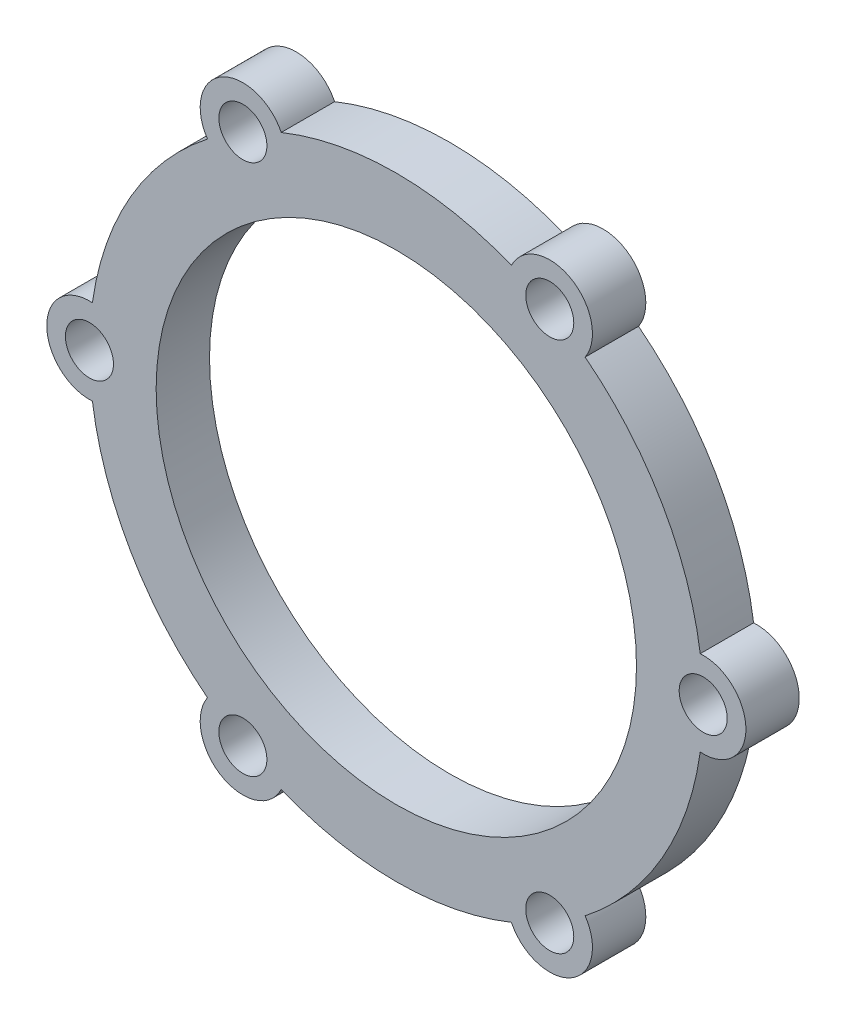
ISO-10303-21;
HEADER;
FILE_DESCRIPTION(('STEP AP214'),'2;1');
FILE_NAME('part.step','',(''),(''),'','','');
FILE_SCHEMA(('AUTOMOTIVE_DESIGN { 1 0 10303 214 1 1 1 1 }'));
ENDSEC;
DATA;
#1=APPLICATION_CONTEXT('core data for automotive mechanical design processes');
#2=APPLICATION_PROTOCOL_DEFINITION('international standard','automotive_design',2000,#1);
#3=PRODUCT_CONTEXT('',#1,'mechanical');
#4=PRODUCT('Part','Part','',(#3));
#5=PRODUCT_RELATED_PRODUCT_CATEGORY('part','',(#4));
#6=PRODUCT_DEFINITION_FORMATION('','',#4);
#7=PRODUCT_DEFINITION_CONTEXT('part definition',#1,'design');
#8=PRODUCT_DEFINITION('design','',#6,#7);
#9=PRODUCT_DEFINITION_SHAPE('','',#8);
#10=(LENGTH_UNIT() NAMED_UNIT(*) SI_UNIT(.MILLI.,.METRE.));
#11=(NAMED_UNIT(*) PLANE_ANGLE_UNIT() SI_UNIT($,.RADIAN.));
#12=(NAMED_UNIT(*) SI_UNIT($,.STERADIAN.) SOLID_ANGLE_UNIT());
#13=UNCERTAINTY_MEASURE_WITH_UNIT(LENGTH_MEASURE(1.E-05),#10,'distance_accuracy_value','');
#14=(GEOMETRIC_REPRESENTATION_CONTEXT(3) GLOBAL_UNCERTAINTY_ASSIGNED_CONTEXT((#13)) GLOBAL_UNIT_ASSIGNED_CONTEXT((#10,
#11,#12)) REPRESENTATION_CONTEXT('',''));
#15=CARTESIAN_POINT('',(0.,0.,0.));
#16=DIRECTION('',(0.,0.,1.));
#17=DIRECTION('',(1.,0.,0.));
#18=AXIS2_PLACEMENT_3D('',#15,#16,#17);
#19=CARTESIAN_POINT('',(0.,0.,5.));
#20=DIRECTION('',(0.,0.,-1.));
#21=DIRECTION('',(-1.,0.,0.));
#22=AXIS2_PLACEMENT_3D('',#19,#20,#21);
#23=CYLINDRICAL_SURFACE('',#22,57.5);
#24=CARTESIAN_POINT('',(0.,0.,-5.));
#25=DIRECTION('',(0.,0.,1.));
#26=DIRECTION('',(1.,0.,0.));
#27=AXIS2_PLACEMENT_3D('',#24,#25,#26);
#28=CIRCLE('',#27,57.5);
#29=CARTESIAN_POINT('',(-21.5603201252367,-53.3048083768933,-5.));
#30=VERTEX_POINT('',#29);
#31=CARTESIAN_POINT('',(21.5603201252378,-53.3048083768929,-5.));
#32=VERTEX_POINT('',#31);
#33=EDGE_CURVE('E181',#30,#32,#28,.T.);
#34=ORIENTED_EDGE('',*,*,#33,.T.);
#35=DIRECTION('',(0.,0.,1.));
#36=VECTOR('',#35,1.);
#37=CARTESIAN_POINT('',(21.5603201252378,-53.3048083768928,0.));
#38=LINE('',#37,#36);
#39=CARTESIAN_POINT('',(21.5603201252378,-53.3048083768929,5.));
#40=VERTEX_POINT('',#39);
#41=EDGE_CURVE('E12',#32,#40,#38,.T.);
#42=ORIENTED_EDGE('',*,*,#41,.T.);
#43=CARTESIAN_POINT('',(0.,0.,5.));
#44=DIRECTION('',(0.,0.,1.));
#45=DIRECTION('',(1.,0.,0.));
#46=AXIS2_PLACEMENT_3D('',#43,#44,#45);
#47=CIRCLE('',#46,57.5);
#48=CARTESIAN_POINT('',(-21.5603201252367,-53.3048083768933,5.));
#49=VERTEX_POINT('',#48);
#50=EDGE_CURVE('E180',#49,#40,#47,.T.);
#51=ORIENTED_EDGE('',*,*,#50,.F.);
#52=DIRECTION('',(0.,0.,1.));
#53=VECTOR('',#52,1.);
#54=CARTESIAN_POINT('',(-21.5603201252367,-53.3048083768933,0.));
#55=LINE('',#54,#53);
#56=EDGE_CURVE('E234',#49,#30,#55,.F.);
#57=ORIENTED_EDGE('',*,*,#56,.T.);
#58=EDGE_LOOP('',(#34,#42,#51,#57));
#59=FACE_BOUND('',#58,.T.);
#60=ADVANCED_FACE('F51',(#59),#23,.T.);
#61=CARTESIAN_POINT('',(-56.9434782608696,-7.98061924626624,-5.));
#62=VERTEX_POINT('',#61);
#63=CARTESIAN_POINT('',(-35.383158135632,-45.3241891306272,-5.));
#64=VERTEX_POINT('',#63);
#65=EDGE_CURVE('E195',#62,#64,#28,.T.);
#66=ORIENTED_EDGE('',*,*,#65,.T.);
#67=DIRECTION('',(0.,0.,1.));
#68=VECTOR('',#67,1.);
#69=CARTESIAN_POINT('',(-35.383158135632,-45.3241891306272,0.));
#70=LINE('',#69,#68);
#71=CARTESIAN_POINT('',(-35.383158135632,-45.3241891306272,5.));
#72=VERTEX_POINT('',#71);
#73=EDGE_CURVE('E311',#64,#72,#70,.T.);
#74=ORIENTED_EDGE('',*,*,#73,.T.);
#75=CARTESIAN_POINT('',(-56.9434782608696,-7.98061924626624,5.));
#76=VERTEX_POINT('',#75);
#77=EDGE_CURVE('E220',#76,#72,#47,.T.);
#78=ORIENTED_EDGE('',*,*,#77,.F.);
#79=DIRECTION('',(0.,0.,1.));
#80=VECTOR('',#79,1.);
#81=CARTESIAN_POINT('',(-56.9434782608696,-7.98061924626624,0.));
#82=LINE('',#81,#80);
#83=EDGE_CURVE('E303',#76,#62,#82,.F.);
#84=ORIENTED_EDGE('',*,*,#83,.T.);
#85=EDGE_LOOP('',(#66,#74,#78,#84));
#86=FACE_BOUND('',#85,.T.);
#87=ADVANCED_FACE('F393',(#86),#23,.T.);
#88=CARTESIAN_POINT('',(-35.3831581356326,45.3241891306267,-5.));
#89=VERTEX_POINT('',#88);
#90=CARTESIAN_POINT('',(-56.9434782608696,7.98061924626624,-5.));
#91=VERTEX_POINT('',#90);
#92=EDGE_CURVE('E176',#89,#91,#28,.T.);
#93=ORIENTED_EDGE('',*,*,#92,.T.);
#94=DIRECTION('',(0.,0.,1.));
#95=VECTOR('',#94,1.);
#96=CARTESIAN_POINT('',(-56.9434782608696,7.98061924626624,0.));
#97=LINE('',#96,#95);
#98=CARTESIAN_POINT('',(-56.9434782608696,7.98061924626624,5.));
#99=VERTEX_POINT('',#98);
#100=EDGE_CURVE('E307',#91,#99,#97,.T.);
#101=ORIENTED_EDGE('',*,*,#100,.T.);
#102=CARTESIAN_POINT('',(-35.3831581356326,45.3241891306267,5.));
#103=VERTEX_POINT('',#102);
#104=EDGE_CURVE('E215',#103,#99,#47,.T.);
#105=ORIENTED_EDGE('',*,*,#104,.F.);
#106=DIRECTION('',(0.,0.,1.));
#107=VECTOR('',#106,1.);
#108=CARTESIAN_POINT('',(-35.3831581356326,45.3241891306267,0.));
#109=LINE('',#108,#107);
#110=EDGE_CURVE('E155',#103,#89,#109,.F.);
#111=ORIENTED_EDGE('',*,*,#110,.T.);
#112=EDGE_LOOP('',(#93,#101,#105,#111));
#113=FACE_BOUND('',#112,.T.);
#114=ADVANCED_FACE('F399',(#113),#23,.T.);
#115=CARTESIAN_POINT('',(21.5603201252371,53.3048083768931,-5.));
#116=VERTEX_POINT('',#115);
#117=CARTESIAN_POINT('',(-21.5603201252374,53.304808376893,-5.));
#118=VERTEX_POINT('',#117);
#119=EDGE_CURVE('E163',#116,#118,#28,.T.);
#120=ORIENTED_EDGE('',*,*,#119,.T.);
#121=DIRECTION('',(0.,0.,1.));
#122=VECTOR('',#121,1.);
#123=CARTESIAN_POINT('',(-21.5603201252374,53.304808376893,0.));
#124=LINE('',#123,#122);
#125=CARTESIAN_POINT('',(-21.5603201252374,53.304808376893,5.));
#126=VERTEX_POINT('',#125);
#127=EDGE_CURVE('E296',#118,#126,#124,.T.);
#128=ORIENTED_EDGE('',*,*,#127,.T.);
#129=CARTESIAN_POINT('',(21.5603201252371,53.3048083768931,5.));
#130=VERTEX_POINT('',#129);
#131=EDGE_CURVE('E202',#130,#126,#47,.T.);
#132=ORIENTED_EDGE('',*,*,#131,.F.);
#133=DIRECTION('',(0.,0.,1.));
#134=VECTOR('',#133,1.);
#135=CARTESIAN_POINT('',(21.5603201252371,53.3048083768931,0.));
#136=LINE('',#135,#134);
#137=EDGE_CURVE('E153',#130,#116,#136,.F.);
#138=ORIENTED_EDGE('',*,*,#137,.T.);
#139=EDGE_LOOP('',(#120,#128,#132,#138));
#140=FACE_BOUND('',#139,.T.);
#141=ADVANCED_FACE('F409',(#140),#23,.T.);
#142=CARTESIAN_POINT('',(56.9434782608696,7.98061924626624,-5.));
#143=VERTEX_POINT('',#142);
#144=CARTESIAN_POINT('',(35.3831581356323,45.3241891306269,-5.));
#145=VERTEX_POINT('',#144);
#146=EDGE_CURVE('E161',#143,#145,#28,.T.);
#147=ORIENTED_EDGE('',*,*,#146,.T.);
#148=DIRECTION('',(0.,0.,1.));
#149=VECTOR('',#148,1.);
#150=CARTESIAN_POINT('',(35.3831581356323,45.3241891306269,0.));
#151=LINE('',#150,#149);
#152=CARTESIAN_POINT('',(35.3831581356323,45.3241891306269,5.));
#153=VERTEX_POINT('',#152);
#154=EDGE_CURVE('E136',#145,#153,#151,.T.);
#155=ORIENTED_EDGE('',*,*,#154,.T.);
#156=CARTESIAN_POINT('',(56.9434782608696,7.98061924626624,5.));
#157=VERTEX_POINT('',#156);
#158=EDGE_CURVE('E179',#157,#153,#47,.T.);
#159=ORIENTED_EDGE('',*,*,#158,.F.);
#160=DIRECTION('',(0.,0.,1.));
#161=VECTOR('',#160,1.);
#162=CARTESIAN_POINT('',(56.9434782608696,7.98061924626624,0.));
#163=LINE('',#162,#161);
#164=EDGE_CURVE('E168',#157,#143,#163,.F.);
#165=ORIENTED_EDGE('',*,*,#164,.T.);
#166=EDGE_LOOP('',(#147,#155,#159,#165));
#167=FACE_BOUND('',#166,.T.);
#168=ADVANCED_FACE('F166',(#167),#23,.T.);
#169=CARTESIAN_POINT('',(0.,0.,5.));
#170=DIRECTION('',(0.,0.,1.));
#171=DIRECTION('',(1.,0.,0.));
#172=AXIS2_PLACEMENT_3D('',#169,#170,#171);
#173=PLANE('',#172);
#174=CARTESIAN_POINT('',(28.7500000000006,-49.7964607176049,5.));
#175=DIRECTION('',(0.,0.,1.));
#176=DIRECTION('',(1.,0.,0.));
#177=AXIS2_PLACEMENT_3D('',#174,#175,#176);
#178=CIRCLE('',#177,4.5);
#179=CARTESIAN_POINT('',(33.2500000000006,-49.7964607176049,5.));
#180=VERTEX_POINT('',#179);
#181=EDGE_CURVE('E245',#180,#180,#178,.T.);
#182=ORIENTED_EDGE('',*,*,#181,.F.);
#183=EDGE_LOOP('',(#182));
#184=FACE_BOUND('',#183,.T.);
#185=CARTESIAN_POINT('',(-28.7499999999995,-49.7964607176055,5.));
#186=DIRECTION('',(0.,0.,1.));
#187=DIRECTION('',(1.,0.,0.));
#188=AXIS2_PLACEMENT_3D('',#185,#186,#187);
#189=CIRCLE('',#188,4.5);
#190=CARTESIAN_POINT('',(-24.2499999999995,-49.7964607176055,5.));
#191=VERTEX_POINT('',#190);
#192=EDGE_CURVE('E338',#191,#191,#189,.T.);
#193=ORIENTED_EDGE('',*,*,#192,.F.);
#194=EDGE_LOOP('',(#193));
#195=FACE_BOUND('',#194,.T.);
#196=CARTESIAN_POINT('',(-57.5,0.,5.));
#197=DIRECTION('',(0.,0.,1.));
#198=DIRECTION('',(1.,0.,0.));
#199=AXIS2_PLACEMENT_3D('',#196,#197,#198);
#200=CIRCLE('',#199,4.5);
#201=CARTESIAN_POINT('',(-53.,0.,5.));
#202=VERTEX_POINT('',#201);
#203=EDGE_CURVE('E344',#202,#202,#200,.T.);
#204=ORIENTED_EDGE('',*,*,#203,.F.);
#205=EDGE_LOOP('',(#204));
#206=FACE_BOUND('',#205,.T.);
#207=CARTESIAN_POINT('',(-28.7500000000002,49.7964607176051,5.));
#208=DIRECTION('',(0.,0.,1.));
#209=DIRECTION('',(1.,0.,0.));
#210=AXIS2_PLACEMENT_3D('',#207,#208,#209);
#211=CIRCLE('',#210,4.5);
#212=CARTESIAN_POINT('',(-24.2500000000002,49.7964607176051,5.));
#213=VERTEX_POINT('',#212);
#214=EDGE_CURVE('E346',#213,#213,#211,.T.);
#215=ORIENTED_EDGE('',*,*,#214,.F.);
#216=EDGE_LOOP('',(#215));
#217=FACE_BOUND('',#216,.T.);
#218=CARTESIAN_POINT('',(28.7499999999999,49.7964607176053,5.));
#219=DIRECTION('',(0.,0.,1.));
#220=DIRECTION('',(1.,0.,0.));
#221=AXIS2_PLACEMENT_3D('',#218,#219,#220);
#222=CIRCLE('',#221,4.5);
#223=CARTESIAN_POINT('',(33.2499999999999,49.7964607176053,5.));
#224=VERTEX_POINT('',#223);
#225=EDGE_CURVE('E355',#224,#224,#222,.T.);
#226=ORIENTED_EDGE('',*,*,#225,.F.);
#227=EDGE_LOOP('',(#226));
#228=FACE_BOUND('',#227,.T.);
#229=ORIENTED_EDGE('',*,*,#50,.T.);
#230=CARTESIAN_POINT('',(28.7500000000006,-49.7964607176049,5.));
#231=DIRECTION('',(0.,0.,1.));
#232=DIRECTION('',(0.50000000000001,-0.866025403784433,0.));
#233=AXIS2_PLACEMENT_3D('',#230,#231,#232);
#234=CIRCLE('',#233,8.);
#235=CARTESIAN_POINT('',(35.3831581356329,-45.3241891306265,5.));
#236=VERTEX_POINT('',#235);
#237=EDGE_CURVE('E228',#40,#236,#234,.T.);
#238=ORIENTED_EDGE('',*,*,#237,.T.);
#239=CARTESIAN_POINT('',(56.9434782608696,-7.98061924626624,5.));
#240=VERTEX_POINT('',#239);
#241=EDGE_CURVE('E175',#236,#240,#47,.T.);
#242=ORIENTED_EDGE('',*,*,#241,.T.);
#243=CARTESIAN_POINT('',(57.5,0.,5.));
#244=DIRECTION('',(0.,0.,1.));
#245=DIRECTION('',(1.,0.,0.));
#246=AXIS2_PLACEMENT_3D('',#243,#244,#245);
#247=CIRCLE('',#246,8.);
#248=EDGE_CURVE('E251',#240,#157,#247,.T.);
#249=ORIENTED_EDGE('',*,*,#248,.T.);
#250=ORIENTED_EDGE('',*,*,#158,.T.);
#251=CARTESIAN_POINT('',(28.7499999999999,49.7964607176053,5.));
#252=DIRECTION('',(0.,0.,1.));
#253=DIRECTION('',(0.499999999999998,0.86602540378444,0.));
#254=AXIS2_PLACEMENT_3D('',#251,#252,#253);
#255=CIRCLE('',#254,8.);
#256=EDGE_CURVE('E148',#153,#130,#255,.T.);
#257=ORIENTED_EDGE('',*,*,#256,.T.);
#258=ORIENTED_EDGE('',*,*,#131,.T.);
#259=CARTESIAN_POINT('',(-28.7500000000002,49.7964607176051,5.));
#260=DIRECTION('',(0.,0.,1.));
#261=DIRECTION('',(-0.500000000000004,0.866025403784436,0.));
#262=AXIS2_PLACEMENT_3D('',#259,#260,#261);
#263=CIRCLE('',#262,8.);
#264=EDGE_CURVE('E323',#126,#103,#263,.T.);
#265=ORIENTED_EDGE('',*,*,#264,.T.);
#266=ORIENTED_EDGE('',*,*,#104,.T.);
#267=CARTESIAN_POINT('',(-57.5,0.,5.));
#268=DIRECTION('',(0.,0.,1.));
#269=DIRECTION('',(-1.,0.,0.));
#270=AXIS2_PLACEMENT_3D('',#267,#268,#269);
#271=CIRCLE('',#270,8.);
#272=EDGE_CURVE('E329',#99,#76,#271,.T.);
#273=ORIENTED_EDGE('',*,*,#272,.T.);
#274=ORIENTED_EDGE('',*,*,#77,.T.);
#275=CARTESIAN_POINT('',(-28.7499999999995,-49.7964607176055,5.));
#276=DIRECTION('',(0.,0.,1.));
#277=DIRECTION('',(-0.499999999999992,-0.866025403784443,0.));
#278=AXIS2_PLACEMENT_3D('',#275,#276,#277);
#279=CIRCLE('',#278,8.);
#280=EDGE_CURVE('E235',#72,#49,#279,.T.);
#281=ORIENTED_EDGE('',*,*,#280,.T.);
#282=EDGE_LOOP('',(#229,#238,#242,#249,#250,#257,#258,#265,#266,#273,#274,#281));
#283=FACE_BOUND('',#282,.T.);
#284=CARTESIAN_POINT('',(57.5,0.,5.000012));
#285=DIRECTION('',(0.,0.,1.));
#286=DIRECTION('',(1.,0.,0.));
#287=AXIS2_PLACEMENT_3D('',#284,#285,#286);
#288=CIRCLE('',#287,4.5);
#289=CARTESIAN_POINT('',(62.,0.,5.000012));
#290=VERTEX_POINT('',#289);
#291=EDGE_CURVE('E167',#290,#290,#288,.T.);
#292=ORIENTED_EDGE('',*,*,#291,.F.);
#293=EDGE_LOOP('',(#292));
#294=FACE_BOUND('',#293,.T.);
#295=CARTESIAN_POINT('',(0.,0.,5.));
#296=DIRECTION('',(0.,0.,1.));
#297=DIRECTION('',(0.,1.,0.));
#298=AXIS2_PLACEMENT_3D('',#295,#296,#297);
#299=CIRCLE('',#298,45.);
#300=CARTESIAN_POINT('',(0.,45.,5.));
#301=VERTEX_POINT('',#300);
#302=EDGE_CURVE('E184',#301,#301,#299,.T.);
#303=ORIENTED_EDGE('',*,*,#302,.F.);
#304=EDGE_LOOP('',(#303));
#305=FACE_BOUND('',#304,.T.);
#306=ADVANCED_FACE('F229',(#184,#195,#206,#217,#228,#283,#294,#305),#173,.T.);
#307=CARTESIAN_POINT('',(0.,0.,-5.));
#308=DIRECTION('',(0.,0.,1.));
#309=DIRECTION('',(1.,0.,0.));
#310=AXIS2_PLACEMENT_3D('',#307,#308,#309);
#311=PLANE('',#310);
#312=CARTESIAN_POINT('',(28.7500000000006,-49.7964607176049,-5.));
#313=DIRECTION('',(0.,0.,1.));
#314=DIRECTION('',(0.50000000000001,-0.866025403784433,0.));
#315=AXIS2_PLACEMENT_3D('',#312,#313,#314);
#316=CIRCLE('',#315,4.5);
#317=CARTESIAN_POINT('',(31.0000000000006,-53.6935750346348,-5.));
#318=VERTEX_POINT('',#317);
#319=EDGE_CURVE('E363',#318,#318,#316,.T.);
#320=ORIENTED_EDGE('',*,*,#319,.T.);
#321=EDGE_LOOP('',(#320));
#322=FACE_BOUND('',#321,.T.);
#323=CARTESIAN_POINT('',(-28.7499999999995,-49.7964607176055,-5.));
#324=DIRECTION('',(0.,0.,1.));
#325=DIRECTION('',(-0.499999999999992,-0.866025403784443,0.));
#326=AXIS2_PLACEMENT_3D('',#323,#324,#325);
#327=CIRCLE('',#326,4.5);
#328=CARTESIAN_POINT('',(-30.9999999999995,-53.6935750346355,-5.));
#329=VERTEX_POINT('',#328);
#330=EDGE_CURVE('E364',#329,#329,#327,.T.);
#331=ORIENTED_EDGE('',*,*,#330,.T.);
#332=EDGE_LOOP('',(#331));
#333=FACE_BOUND('',#332,.T.);
#334=CARTESIAN_POINT('',(-57.5,0.,-5.));
#335=DIRECTION('',(0.,0.,1.));
#336=DIRECTION('',(-1.,0.,0.));
#337=AXIS2_PLACEMENT_3D('',#334,#335,#336);
#338=CIRCLE('',#337,4.5);
#339=CARTESIAN_POINT('',(-62.,0.,-5.));
#340=VERTEX_POINT('',#339);
#341=EDGE_CURVE('E369',#340,#340,#338,.T.);
#342=ORIENTED_EDGE('',*,*,#341,.T.);
#343=EDGE_LOOP('',(#342));
#344=FACE_BOUND('',#343,.T.);
#345=CARTESIAN_POINT('',(-28.7500000000002,49.7964607176051,-5.));
#346=DIRECTION('',(0.,0.,1.));
#347=DIRECTION('',(-0.500000000000004,0.866025403784436,0.));
#348=AXIS2_PLACEMENT_3D('',#345,#346,#347);
#349=CIRCLE('',#348,4.5);
#350=CARTESIAN_POINT('',(-31.0000000000003,53.6935750346351,-5.));
#351=VERTEX_POINT('',#350);
#352=EDGE_CURVE('E356',#351,#351,#349,.T.);
#353=ORIENTED_EDGE('',*,*,#352,.T.);
#354=EDGE_LOOP('',(#353));
#355=FACE_BOUND('',#354,.T.);
#356=CARTESIAN_POINT('',(28.7499999999999,49.7964607176053,-5.));
#357=DIRECTION('',(0.,0.,1.));
#358=DIRECTION('',(0.499999999999998,0.86602540378444,0.));
#359=AXIS2_PLACEMENT_3D('',#356,#357,#358);
#360=CIRCLE('',#359,4.5);
#361=CARTESIAN_POINT('',(30.9999999999999,53.6935750346353,-5.));
#362=VERTEX_POINT('',#361);
#363=EDGE_CURVE('E357',#362,#362,#360,.T.);
#364=ORIENTED_EDGE('',*,*,#363,.T.);
#365=EDGE_LOOP('',(#364));
#366=FACE_BOUND('',#365,.T.);
#367=ORIENTED_EDGE('',*,*,#119,.F.);
#368=CARTESIAN_POINT('',(28.7499999999999,49.7964607176053,-5.));
#369=DIRECTION('',(0.,0.,1.));
#370=DIRECTION('',(1.,0.,0.));
#371=AXIS2_PLACEMENT_3D('',#368,#369,#370);
#372=CIRCLE('',#371,8.);
#373=EDGE_CURVE('E141',#116,#145,#372,.F.);
#374=ORIENTED_EDGE('',*,*,#373,.T.);
#375=ORIENTED_EDGE('',*,*,#146,.F.);
#376=CARTESIAN_POINT('',(57.5,0.,-5.));
#377=DIRECTION('',(0.,0.,1.));
#378=DIRECTION('',(1.,0.,0.));
#379=AXIS2_PLACEMENT_3D('',#376,#377,#378);
#380=CIRCLE('',#379,8.);
#381=CARTESIAN_POINT('',(56.9434782608696,-7.98061924626624,-5.));
#382=VERTEX_POINT('',#381);
#383=EDGE_CURVE('E199',#143,#382,#380,.F.);
#384=ORIENTED_EDGE('',*,*,#383,.T.);
#385=CARTESIAN_POINT('',(35.3831581356329,-45.3241891306264,-5.));
#386=VERTEX_POINT('',#385);
#387=EDGE_CURVE('E171',#386,#382,#28,.T.);
#388=ORIENTED_EDGE('',*,*,#387,.F.);
#389=CARTESIAN_POINT('',(28.7500000000006,-49.7964607176049,-5.));
#390=DIRECTION('',(0.,0.,1.));
#391=DIRECTION('',(1.,0.,0.));
#392=AXIS2_PLACEMENT_3D('',#389,#390,#391);
#393=CIRCLE('',#392,8.);
#394=EDGE_CURVE('E70',#386,#32,#393,.F.);
#395=ORIENTED_EDGE('',*,*,#394,.T.);
#396=ORIENTED_EDGE('',*,*,#33,.F.);
#397=CARTESIAN_POINT('',(-28.7499999999995,-49.7964607176055,-5.));
#398=DIRECTION('',(0.,0.,1.));
#399=DIRECTION('',(1.,0.,0.));
#400=AXIS2_PLACEMENT_3D('',#397,#398,#399);
#401=CIRCLE('',#400,8.);
#402=EDGE_CURVE('E73',#30,#64,#401,.F.);
#403=ORIENTED_EDGE('',*,*,#402,.T.);
#404=ORIENTED_EDGE('',*,*,#65,.F.);
#405=CARTESIAN_POINT('',(-57.5,0.,-5.));
#406=DIRECTION('',(0.,0.,1.));
#407=DIRECTION('',(1.,0.,0.));
#408=AXIS2_PLACEMENT_3D('',#405,#406,#407);
#409=CIRCLE('',#408,8.);
#410=EDGE_CURVE('E326',#62,#91,#409,.F.);
#411=ORIENTED_EDGE('',*,*,#410,.T.);
#412=ORIENTED_EDGE('',*,*,#92,.F.);
#413=CARTESIAN_POINT('',(-28.7500000000002,49.7964607176051,-5.));
#414=DIRECTION('',(0.,0.,1.));
#415=DIRECTION('',(1.,0.,0.));
#416=AXIS2_PLACEMENT_3D('',#413,#414,#415);
#417=CIRCLE('',#416,8.);
#418=EDGE_CURVE('E250',#89,#118,#417,.F.);
#419=ORIENTED_EDGE('',*,*,#418,.T.);
#420=EDGE_LOOP('',(#367,#374,#375,#384,#388,#395,#396,#403,#404,#411,#412,#419));
#421=FACE_BOUND('',#420,.T.);
#422=CARTESIAN_POINT('',(0.,0.,-5.));
#423=DIRECTION('',(0.,0.,1.));
#424=DIRECTION('',(0.,1.,0.));
#425=AXIS2_PLACEMENT_3D('',#422,#423,#424);
#426=CIRCLE('',#425,45.);
#427=CARTESIAN_POINT('',(0.,45.,-5.));
#428=VERTEX_POINT('',#427);
#429=EDGE_CURVE('E194',#428,#428,#426,.T.);
#430=ORIENTED_EDGE('',*,*,#429,.T.);
#431=EDGE_LOOP('',(#430));
#432=FACE_BOUND('',#431,.T.);
#433=CARTESIAN_POINT('',(57.5,0.,-5.));
#434=DIRECTION('',(0.,0.,1.));
#435=DIRECTION('',(1.,0.,0.));
#436=AXIS2_PLACEMENT_3D('',#433,#434,#435);
#437=CIRCLE('',#436,4.5);
#438=CARTESIAN_POINT('',(62.,0.,-5.));
#439=VERTEX_POINT('',#438);
#440=EDGE_CURVE('E249',#439,#439,#437,.T.);
#441=ORIENTED_EDGE('',*,*,#440,.T.);
#442=EDGE_LOOP('',(#441));
#443=FACE_BOUND('',#442,.T.);
#444=ADVANCED_FACE('F158',(#322,#333,#344,#355,#366,#421,#432,#443),#311,.F.);
#445=ORIENTED_EDGE('',*,*,#241,.F.);
#446=DIRECTION('',(0.,0.,1.));
#447=VECTOR('',#446,1.);
#448=CARTESIAN_POINT('',(35.3831581356329,-45.3241891306265,0.));
#449=LINE('',#448,#447);
#450=EDGE_CURVE('E58',#236,#386,#449,.F.);
#451=ORIENTED_EDGE('',*,*,#450,.T.);
#452=ORIENTED_EDGE('',*,*,#387,.T.);
#453=DIRECTION('',(0.,0.,1.));
#454=VECTOR('',#453,1.);
#455=CARTESIAN_POINT('',(56.9434782608696,-7.98061924626624,0.));
#456=LINE('',#455,#454);
#457=EDGE_CURVE('E209',#382,#240,#456,.T.);
#458=ORIENTED_EDGE('',*,*,#457,.T.);
#459=EDGE_LOOP('',(#445,#451,#452,#458));
#460=FACE_BOUND('',#459,.T.);
#461=ADVANCED_FACE('F52',(#460),#23,.T.);
#462=CARTESIAN_POINT('',(0.,0.,5.));
#463=DIRECTION('',(0.,0.,-1.));
#464=DIRECTION('',(-1.,0.,0.));
#465=AXIS2_PLACEMENT_3D('',#462,#463,#464);
#466=CYLINDRICAL_SURFACE('',#465,45.);
#467=ORIENTED_EDGE('',*,*,#302,.T.);
#468=EDGE_LOOP('',(#467));
#469=FACE_BOUND('',#468,.T.);
#470=ORIENTED_EDGE('',*,*,#429,.F.);
#471=EDGE_LOOP('',(#470));
#472=FACE_BOUND('',#471,.T.);
#473=ADVANCED_FACE('F277',(#469,#472),#466,.F.);
#474=CARTESIAN_POINT('',(57.5,0.,-27.6274169979695));
#475=DIRECTION('',(0.,0.,1.));
#476=DIRECTION('',(1.,0.,0.));
#477=AXIS2_PLACEMENT_3D('',#474,#475,#476);
#478=CYLINDRICAL_SURFACE('',#477,8.);
#479=ORIENTED_EDGE('',*,*,#457,.F.);
#480=ORIENTED_EDGE('',*,*,#383,.F.);
#481=ORIENTED_EDGE('',*,*,#164,.F.);
#482=ORIENTED_EDGE('',*,*,#248,.F.);
#483=EDGE_LOOP('',(#479,#480,#481,#482));
#484=FACE_BOUND('',#483,.T.);
#485=ADVANCED_FACE('F271',(#484),#478,.T.);
#486=CARTESIAN_POINT('',(57.5,0.,-5.));
#487=DIRECTION('',(0.,0.,1.));
#488=DIRECTION('',(1.,0.,0.));
#489=AXIS2_PLACEMENT_3D('',#486,#487,#488);
#490=CYLINDRICAL_SURFACE('',#489,4.5);
#491=ORIENTED_EDGE('',*,*,#440,.F.);
#492=EDGE_LOOP('',(#491));
#493=FACE_BOUND('',#492,.T.);
#494=ORIENTED_EDGE('',*,*,#291,.T.);
#495=EDGE_LOOP('',(#494));
#496=FACE_BOUND('',#495,.T.);
#497=ADVANCED_FACE('F261',(#493,#496),#490,.F.);
#498=CARTESIAN_POINT('',(28.7499999999999,49.7964607176053,-27.6274169979695));
#499=DIRECTION('',(0.,0.,1.));
#500=DIRECTION('',(1.,0.,0.));
#501=AXIS2_PLACEMENT_3D('',#498,#499,#500);
#502=CYLINDRICAL_SURFACE('',#501,8.);
#503=ORIENTED_EDGE('',*,*,#154,.F.);
#504=ORIENTED_EDGE('',*,*,#373,.F.);
#505=ORIENTED_EDGE('',*,*,#137,.F.);
#506=ORIENTED_EDGE('',*,*,#256,.F.);
#507=EDGE_LOOP('',(#503,#504,#505,#506));
#508=FACE_BOUND('',#507,.T.);
#509=ADVANCED_FACE('F142',(#508),#502,.T.);
#510=CARTESIAN_POINT('',(-28.7500000000002,49.7964607176051,-27.6274169979695));
#511=DIRECTION('',(0.,0.,1.));
#512=DIRECTION('',(1.,0.,0.));
#513=AXIS2_PLACEMENT_3D('',#510,#511,#512);
#514=CYLINDRICAL_SURFACE('',#513,8.);
#515=ORIENTED_EDGE('',*,*,#127,.F.);
#516=ORIENTED_EDGE('',*,*,#418,.F.);
#517=ORIENTED_EDGE('',*,*,#110,.F.);
#518=ORIENTED_EDGE('',*,*,#264,.F.);
#519=EDGE_LOOP('',(#515,#516,#517,#518));
#520=FACE_BOUND('',#519,.T.);
#521=ADVANCED_FACE('F416',(#520),#514,.T.);
#522=CARTESIAN_POINT('',(-57.5,0.,-27.6274169979695));
#523=DIRECTION('',(0.,0.,1.));
#524=DIRECTION('',(1.,0.,0.));
#525=AXIS2_PLACEMENT_3D('',#522,#523,#524);
#526=CYLINDRICAL_SURFACE('',#525,8.);
#527=ORIENTED_EDGE('',*,*,#100,.F.);
#528=ORIENTED_EDGE('',*,*,#410,.F.);
#529=ORIENTED_EDGE('',*,*,#83,.F.);
#530=ORIENTED_EDGE('',*,*,#272,.F.);
#531=EDGE_LOOP('',(#527,#528,#529,#530));
#532=FACE_BOUND('',#531,.T.);
#533=ADVANCED_FACE('F424',(#532),#526,.T.);
#534=CARTESIAN_POINT('',(-28.7499999999995,-49.7964607176055,-27.6274169979695));
#535=DIRECTION('',(0.,0.,1.));
#536=DIRECTION('',(1.,0.,0.));
#537=AXIS2_PLACEMENT_3D('',#534,#535,#536);
#538=CYLINDRICAL_SURFACE('',#537,8.);
#539=ORIENTED_EDGE('',*,*,#73,.F.);
#540=ORIENTED_EDGE('',*,*,#402,.F.);
#541=ORIENTED_EDGE('',*,*,#56,.F.);
#542=ORIENTED_EDGE('',*,*,#280,.F.);
#543=EDGE_LOOP('',(#539,#540,#541,#542));
#544=FACE_BOUND('',#543,.T.);
#545=ADVANCED_FACE('F426',(#544),#538,.T.);
#546=CARTESIAN_POINT('',(28.7500000000006,-49.7964607176049,-27.6274169979695));
#547=DIRECTION('',(0.,0.,1.));
#548=DIRECTION('',(1.,0.,0.));
#549=AXIS2_PLACEMENT_3D('',#546,#547,#548);
#550=CYLINDRICAL_SURFACE('',#549,8.);
#551=ORIENTED_EDGE('',*,*,#41,.F.);
#552=ORIENTED_EDGE('',*,*,#394,.F.);
#553=ORIENTED_EDGE('',*,*,#450,.F.);
#554=ORIENTED_EDGE('',*,*,#237,.F.);
#555=EDGE_LOOP('',(#551,#552,#553,#554));
#556=FACE_BOUND('',#555,.T.);
#557=ADVANCED_FACE('F237',(#556),#550,.T.);
#558=CARTESIAN_POINT('',(28.7499999999999,49.7964607176053,-5.));
#559=DIRECTION('',(0.,0.,1.));
#560=DIRECTION('',(1.,0.,0.));
#561=AXIS2_PLACEMENT_3D('',#558,#559,#560);
#562=CYLINDRICAL_SURFACE('',#561,4.5);
#563=ORIENTED_EDGE('',*,*,#225,.T.);
#564=EDGE_LOOP('',(#563));
#565=FACE_BOUND('',#564,.T.);
#566=ORIENTED_EDGE('',*,*,#363,.F.);
#567=EDGE_LOOP('',(#566));
#568=FACE_BOUND('',#567,.T.);
#569=ADVANCED_FACE('F385',(#565,#568),#562,.F.);
#570=CARTESIAN_POINT('',(-28.7500000000002,49.7964607176051,-5.));
#571=DIRECTION('',(0.,0.,1.));
#572=DIRECTION('',(1.,0.,0.));
#573=AXIS2_PLACEMENT_3D('',#570,#571,#572);
#574=CYLINDRICAL_SURFACE('',#573,4.5);
#575=ORIENTED_EDGE('',*,*,#214,.T.);
#576=EDGE_LOOP('',(#575));
#577=FACE_BOUND('',#576,.T.);
#578=ORIENTED_EDGE('',*,*,#352,.F.);
#579=EDGE_LOOP('',(#578));
#580=FACE_BOUND('',#579,.T.);
#581=ADVANCED_FACE('F377',(#577,#580),#574,.F.);
#582=CARTESIAN_POINT('',(-57.5,0.,-5.));
#583=DIRECTION('',(0.,0.,1.));
#584=DIRECTION('',(1.,0.,0.));
#585=AXIS2_PLACEMENT_3D('',#582,#583,#584);
#586=CYLINDRICAL_SURFACE('',#585,4.5);
#587=ORIENTED_EDGE('',*,*,#203,.T.);
#588=EDGE_LOOP('',(#587));
#589=FACE_BOUND('',#588,.T.);
#590=ORIENTED_EDGE('',*,*,#341,.F.);
#591=EDGE_LOOP('',(#590));
#592=FACE_BOUND('',#591,.T.);
#593=ADVANCED_FACE('F381',(#589,#592),#586,.F.);
#594=CARTESIAN_POINT('',(-28.7499999999995,-49.7964607176055,-5.));
#595=DIRECTION('',(0.,0.,1.));
#596=DIRECTION('',(1.,0.,0.));
#597=AXIS2_PLACEMENT_3D('',#594,#595,#596);
#598=CYLINDRICAL_SURFACE('',#597,4.5);
#599=ORIENTED_EDGE('',*,*,#192,.T.);
#600=EDGE_LOOP('',(#599));
#601=FACE_BOUND('',#600,.T.);
#602=ORIENTED_EDGE('',*,*,#330,.F.);
#603=EDGE_LOOP('',(#602));
#604=FACE_BOUND('',#603,.T.);
#605=ADVANCED_FACE('F386',(#601,#604),#598,.F.);
#606=CARTESIAN_POINT('',(28.7500000000006,-49.7964607176049,-5.));
#607=DIRECTION('',(0.,0.,1.));
#608=DIRECTION('',(1.,0.,0.));
#609=AXIS2_PLACEMENT_3D('',#606,#607,#608);
#610=CYLINDRICAL_SURFACE('',#609,4.5);
#611=ORIENTED_EDGE('',*,*,#181,.T.);
#612=EDGE_LOOP('',(#611));
#613=FACE_BOUND('',#612,.T.);
#614=ORIENTED_EDGE('',*,*,#319,.F.);
#615=EDGE_LOOP('',(#614));
#616=FACE_BOUND('',#615,.T.);
#617=ADVANCED_FACE('F461',(#613,#616),#610,.F.);
#618=CLOSED_SHELL('',(#60,#87,#114,#141,#168,#306,#444,#461,#473,#485,#497,#509,#521,#533,#545,
#557,#569,#581,#593,#605,#617));
#619=MANIFOLD_SOLID_BREP('B2',#618);
#620=ADVANCED_BREP_SHAPE_REPRESENTATION('',(#18,#619),#14);
#621=SHAPE_DEFINITION_REPRESENTATION(#9,#620);
ENDSEC;
END-ISO-10303-21;
